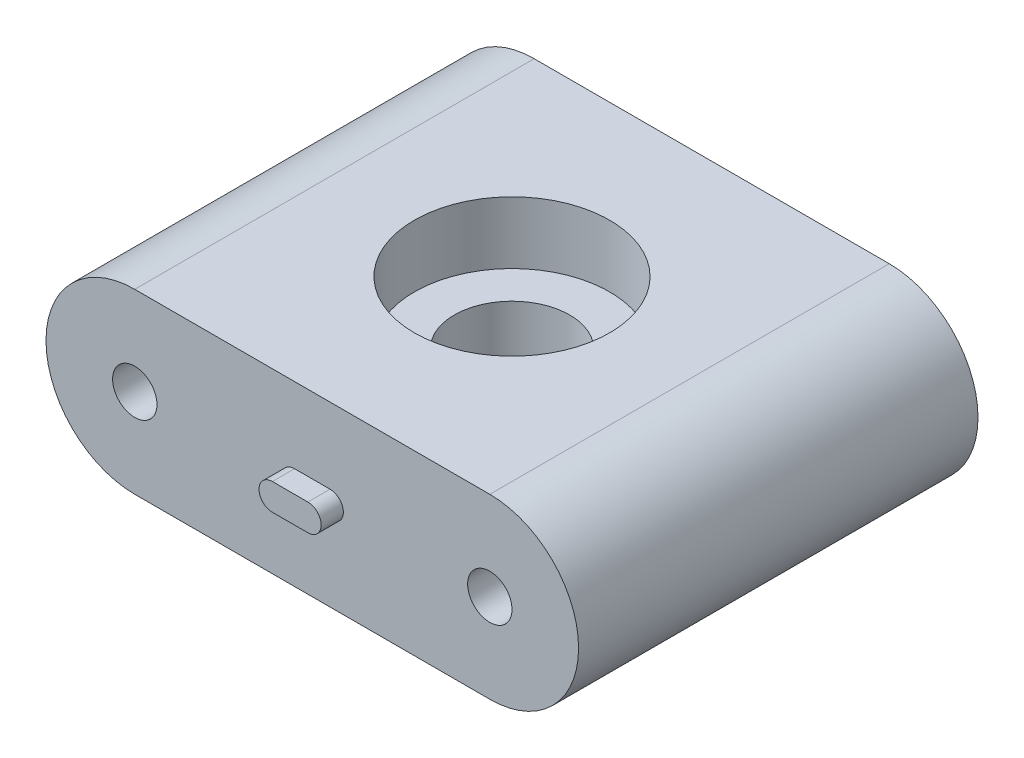
ISO-10303-21;
HEADER;
FILE_DESCRIPTION(('STEP AP214'),'2;1');
FILE_NAME('part.step','',(''),(''),'','','');
FILE_SCHEMA(('AUTOMOTIVE_DESIGN { 1 0 10303 214 1 1 1 1 }'));
ENDSEC;
DATA;
#1=APPLICATION_CONTEXT('core data for automotive mechanical design processes');
#2=APPLICATION_PROTOCOL_DEFINITION('international standard','automotive_design',2000,#1);
#3=PRODUCT_CONTEXT('',#1,'mechanical');
#4=PRODUCT('Part','Part','',(#3));
#5=PRODUCT_RELATED_PRODUCT_CATEGORY('part','',(#4));
#6=PRODUCT_DEFINITION_FORMATION('','',#4);
#7=PRODUCT_DEFINITION_CONTEXT('part definition',#1,'design');
#8=PRODUCT_DEFINITION('design','',#6,#7);
#9=PRODUCT_DEFINITION_SHAPE('','',#8);
#10=(LENGTH_UNIT() NAMED_UNIT(*) SI_UNIT(.MILLI.,.METRE.));
#11=(NAMED_UNIT(*) PLANE_ANGLE_UNIT() SI_UNIT($,.RADIAN.));
#12=(NAMED_UNIT(*) SI_UNIT($,.STERADIAN.) SOLID_ANGLE_UNIT());
#13=UNCERTAINTY_MEASURE_WITH_UNIT(LENGTH_MEASURE(1.E-05),#10,'distance_accuracy_value','');
#14=(GEOMETRIC_REPRESENTATION_CONTEXT(3) GLOBAL_UNCERTAINTY_ASSIGNED_CONTEXT((#13)) GLOBAL_UNIT_ASSIGNED_CONTEXT((#10,
#11,#12)) REPRESENTATION_CONTEXT('',''));
#15=CARTESIAN_POINT('',(0.,0.,0.));
#16=DIRECTION('',(0.,0.,1.));
#17=DIRECTION('',(1.,0.,0.));
#18=AXIS2_PLACEMENT_3D('',#15,#16,#17);
#19=CARTESIAN_POINT('',(-4.,0.,4.5));
#20=DIRECTION('',(0.,0.,1.));
#21=DIRECTION('',(1.,0.,0.));
#22=AXIS2_PLACEMENT_3D('',#19,#20,#21);
#23=PLANE('',#22);
#24=CARTESIAN_POINT('',(-4.,0.,4.5));
#25=DIRECTION('',(0.,0.,1.));
#26=DIRECTION('',(1.,0.,0.));
#27=AXIS2_PLACEMENT_3D('',#24,#25,#26);
#28=CIRCLE('',#27,0.5);
#29=CARTESIAN_POINT('',(-3.5,0.,4.5));
#30=VERTEX_POINT('',#29);
#31=EDGE_CURVE('E204',#30,#30,#28,.T.);
#32=ORIENTED_EDGE('',*,*,#31,.F.);
#33=EDGE_LOOP('',(#32));
#34=FACE_BOUND('',#33,.T.);
#35=CARTESIAN_POINT('',(-4.,0.,4.5));
#36=DIRECTION('',(0.,0.,1.));
#37=DIRECTION('',(1.,0.,0.));
#38=AXIS2_PLACEMENT_3D('',#35,#36,#37);
#39=CIRCLE('',#38,2.);
#40=CARTESIAN_POINT('',(-4.,2.,4.5));
#41=VERTEX_POINT('',#40);
#42=CARTESIAN_POINT('',(-4.,-2.,4.5));
#43=VERTEX_POINT('',#42);
#44=EDGE_CURVE('E212',#41,#43,#39,.T.);
#45=ORIENTED_EDGE('',*,*,#44,.T.);
#46=DIRECTION('',(1.,0.,0.));
#47=VECTOR('',#46,1.);
#48=CARTESIAN_POINT('',(-4.,-2.,4.5));
#49=LINE('',#48,#47);
#50=CARTESIAN_POINT('',(4.,-2.,4.5));
#51=VERTEX_POINT('',#50);
#52=EDGE_CURVE('E216',#43,#51,#49,.T.);
#53=ORIENTED_EDGE('',*,*,#52,.T.);
#54=CARTESIAN_POINT('',(4.,0.,4.5));
#55=DIRECTION('',(0.,0.,1.));
#56=DIRECTION('',(1.,0.,0.));
#57=AXIS2_PLACEMENT_3D('',#54,#55,#56);
#58=CIRCLE('',#57,2.);
#59=CARTESIAN_POINT('',(4.,2.,4.5));
#60=VERTEX_POINT('',#59);
#61=EDGE_CURVE('E220',#51,#60,#58,.T.);
#62=ORIENTED_EDGE('',*,*,#61,.T.);
#63=DIRECTION('',(-1.,0.,0.));
#64=VECTOR('',#63,1.);
#65=CARTESIAN_POINT('',(-4.,2.,4.5));
#66=LINE('',#65,#64);
#67=EDGE_CURVE('E223',#60,#41,#66,.T.);
#68=ORIENTED_EDGE('',*,*,#67,.T.);
#69=EDGE_LOOP('',(#45,#53,#62,#68));
#70=FACE_BOUND('',#69,.T.);
#71=CARTESIAN_POINT('',(4.,0.,4.5));
#72=DIRECTION('',(0.,0.,1.));
#73=DIRECTION('',(1.,0.,0.));
#74=AXIS2_PLACEMENT_3D('',#71,#72,#73);
#75=CIRCLE('',#74,0.500000000000001);
#76=CARTESIAN_POINT('',(4.5,0.,4.5));
#77=VERTEX_POINT('',#76);
#78=EDGE_CURVE('E196',#77,#77,#75,.T.);
#79=ORIENTED_EDGE('',*,*,#78,.F.);
#80=EDGE_LOOP('',(#79));
#81=FACE_BOUND('',#80,.T.);
#82=DIRECTION('',(1.,0.,0.));
#83=VECTOR('',#82,1.);
#84=CARTESIAN_POINT('',(-0.4,-0.3,4.5));
#85=LINE('',#84,#83);
#86=CARTESIAN_POINT('',(-0.4,-0.3,4.5));
#87=VERTEX_POINT('',#86);
#88=CARTESIAN_POINT('',(0.4,-0.3,4.5));
#89=VERTEX_POINT('',#88);
#90=EDGE_CURVE('E176',#87,#89,#85,.T.);
#91=ORIENTED_EDGE('',*,*,#90,.F.);
#92=CARTESIAN_POINT('',(-0.4,0.,4.5));
#93=DIRECTION('',(0.,0.,1.));
#94=DIRECTION('',(1.,0.,0.));
#95=AXIS2_PLACEMENT_3D('',#92,#93,#94);
#96=CIRCLE('',#95,0.3);
#97=CARTESIAN_POINT('',(-0.4,0.3,4.5));
#98=VERTEX_POINT('',#97);
#99=EDGE_CURVE('E161',#98,#87,#96,.T.);
#100=ORIENTED_EDGE('',*,*,#99,.F.);
#101=DIRECTION('',(-1.,0.,0.));
#102=VECTOR('',#101,1.);
#103=CARTESIAN_POINT('',(-0.4,0.3,4.5));
#104=LINE('',#103,#102);
#105=CARTESIAN_POINT('',(0.4,0.3,4.5));
#106=VERTEX_POINT('',#105);
#107=EDGE_CURVE('E61',#106,#98,#104,.T.);
#108=ORIENTED_EDGE('',*,*,#107,.F.);
#109=CARTESIAN_POINT('',(0.4,0.,4.5));
#110=DIRECTION('',(0.,0.,1.));
#111=DIRECTION('',(1.,0.,0.));
#112=AXIS2_PLACEMENT_3D('',#109,#110,#111);
#113=CIRCLE('',#112,0.3);
#114=EDGE_CURVE('E180',#89,#106,#113,.T.);
#115=ORIENTED_EDGE('',*,*,#114,.F.);
#116=EDGE_LOOP('',(#91,#100,#108,#115));
#117=FACE_BOUND('',#116,.T.);
#118=ADVANCED_FACE('F45',(#34,#70,#81,#117),#23,.T.);
#119=CARTESIAN_POINT('',(-4.,0.,-4.5));
#120=DIRECTION('',(0.,0.,1.));
#121=DIRECTION('',(1.,0.,0.));
#122=AXIS2_PLACEMENT_3D('',#119,#120,#121);
#123=PLANE('',#122);
#124=CARTESIAN_POINT('',(4.,0.,-4.5));
#125=DIRECTION('',(0.,0.,1.));
#126=DIRECTION('',(1.,0.,0.));
#127=AXIS2_PLACEMENT_3D('',#124,#125,#126);
#128=CIRCLE('',#127,0.500000000000001);
#129=CARTESIAN_POINT('',(4.5,0.,-4.5));
#130=VERTEX_POINT('',#129);
#131=EDGE_CURVE('E184',#130,#130,#128,.T.);
#132=ORIENTED_EDGE('',*,*,#131,.T.);
#133=EDGE_LOOP('',(#132));
#134=FACE_BOUND('',#133,.T.);
#135=CARTESIAN_POINT('',(-4.,0.,-4.5));
#136=DIRECTION('',(0.,0.,1.));
#137=DIRECTION('',(1.,0.,0.));
#138=AXIS2_PLACEMENT_3D('',#135,#136,#137);
#139=CIRCLE('',#138,0.5);
#140=CARTESIAN_POINT('',(-3.5,0.,-4.5));
#141=VERTEX_POINT('',#140);
#142=EDGE_CURVE('E200',#141,#141,#139,.T.);
#143=ORIENTED_EDGE('',*,*,#142,.T.);
#144=EDGE_LOOP('',(#143));
#145=FACE_BOUND('',#144,.T.);
#146=CARTESIAN_POINT('',(-4.,0.,-4.5));
#147=DIRECTION('',(0.,0.,1.));
#148=DIRECTION('',(1.,0.,0.));
#149=AXIS2_PLACEMENT_3D('',#146,#147,#148);
#150=CIRCLE('',#149,2.);
#151=CARTESIAN_POINT('',(-4.,2.,-4.5));
#152=VERTEX_POINT('',#151);
#153=CARTESIAN_POINT('',(-4.,-2.,-4.5));
#154=VERTEX_POINT('',#153);
#155=EDGE_CURVE('E208',#152,#154,#150,.T.);
#156=ORIENTED_EDGE('',*,*,#155,.F.);
#157=DIRECTION('',(-1.,0.,0.));
#158=VECTOR('',#157,1.);
#159=CARTESIAN_POINT('',(-4.,2.,-4.5));
#160=LINE('',#159,#158);
#161=CARTESIAN_POINT('',(4.,2.,-4.5));
#162=VERTEX_POINT('',#161);
#163=EDGE_CURVE('E217',#162,#152,#160,.T.);
#164=ORIENTED_EDGE('',*,*,#163,.F.);
#165=CARTESIAN_POINT('',(4.,0.,-4.5));
#166=DIRECTION('',(0.,0.,1.));
#167=DIRECTION('',(1.,0.,0.));
#168=AXIS2_PLACEMENT_3D('',#165,#166,#167);
#169=CIRCLE('',#168,2.);
#170=CARTESIAN_POINT('',(4.,-2.,-4.5));
#171=VERTEX_POINT('',#170);
#172=EDGE_CURVE('E233',#171,#162,#169,.T.);
#173=ORIENTED_EDGE('',*,*,#172,.F.);
#174=DIRECTION('',(1.,0.,0.));
#175=VECTOR('',#174,1.);
#176=CARTESIAN_POINT('',(-4.,-2.,-4.5));
#177=LINE('',#176,#175);
#178=EDGE_CURVE('E230',#154,#171,#177,.T.);
#179=ORIENTED_EDGE('',*,*,#178,.F.);
#180=EDGE_LOOP('',(#156,#164,#173,#179));
#181=FACE_BOUND('',#180,.T.);
#182=CARTESIAN_POINT('',(-0.4,0.,-4.5));
#183=DIRECTION('',(0.,0.,1.));
#184=DIRECTION('',(1.,0.,0.));
#185=AXIS2_PLACEMENT_3D('',#182,#183,#184);
#186=CIRCLE('',#185,0.3);
#187=CARTESIAN_POINT('',(-0.4,0.3,-4.5));
#188=VERTEX_POINT('',#187);
#189=CARTESIAN_POINT('',(-0.4,-0.3,-4.5));
#190=VERTEX_POINT('',#189);
#191=EDGE_CURVE('E163',#188,#190,#186,.T.);
#192=ORIENTED_EDGE('',*,*,#191,.T.);
#193=DIRECTION('',(1.,0.,0.));
#194=VECTOR('',#193,1.);
#195=CARTESIAN_POINT('',(-0.4,-0.3,-4.5));
#196=LINE('',#195,#194);
#197=CARTESIAN_POINT('',(0.4,-0.3,-4.5));
#198=VERTEX_POINT('',#197);
#199=EDGE_CURVE('E169',#190,#198,#196,.T.);
#200=ORIENTED_EDGE('',*,*,#199,.T.);
#201=CARTESIAN_POINT('',(0.4,0.,-4.5));
#202=DIRECTION('',(0.,0.,1.));
#203=DIRECTION('',(1.,0.,0.));
#204=AXIS2_PLACEMENT_3D('',#201,#202,#203);
#205=CIRCLE('',#204,0.3);
#206=CARTESIAN_POINT('',(0.4,0.3,-4.5));
#207=VERTEX_POINT('',#206);
#208=EDGE_CURVE('E189',#198,#207,#205,.T.);
#209=ORIENTED_EDGE('',*,*,#208,.T.);
#210=DIRECTION('',(-1.,0.,0.));
#211=VECTOR('',#210,1.);
#212=CARTESIAN_POINT('',(-0.4,0.3,-4.5));
#213=LINE('',#212,#211);
#214=EDGE_CURVE('E177',#207,#188,#213,.T.);
#215=ORIENTED_EDGE('',*,*,#214,.T.);
#216=EDGE_LOOP('',(#192,#200,#209,#215));
#217=FACE_BOUND('',#216,.T.);
#218=ADVANCED_FACE('F256',(#134,#145,#181,#217),#123,.F.);
#219=CARTESIAN_POINT('',(-4.,0.,4.5));
#220=DIRECTION('',(0.,0.,-1.));
#221=DIRECTION('',(-1.,0.,0.));
#222=AXIS2_PLACEMENT_3D('',#219,#220,#221);
#223=CYLINDRICAL_SURFACE('',#222,2.);
#224=ORIENTED_EDGE('',*,*,#155,.T.);
#225=DIRECTION('',(0.,0.,-1.));
#226=VECTOR('',#225,1.);
#227=CARTESIAN_POINT('',(-4.,-2.,4.5));
#228=LINE('',#227,#226);
#229=EDGE_CURVE('E11',#43,#154,#228,.T.);
#230=ORIENTED_EDGE('',*,*,#229,.F.);
#231=ORIENTED_EDGE('',*,*,#44,.F.);
#232=DIRECTION('',(0.,0.,-1.));
#233=VECTOR('',#232,1.);
#234=CARTESIAN_POINT('',(-4.,2.,4.5));
#235=LINE('',#234,#233);
#236=EDGE_CURVE('E226',#41,#152,#235,.T.);
#237=ORIENTED_EDGE('',*,*,#236,.T.);
#238=EDGE_LOOP('',(#224,#230,#231,#237));
#239=FACE_BOUND('',#238,.T.);
#240=ADVANCED_FACE('F47',(#239),#223,.T.);
#241=CARTESIAN_POINT('',(-4.,-2.,4.5));
#242=DIRECTION('',(0.,1.,0.));
#243=DIRECTION('',(0.,0.,1.));
#244=AXIS2_PLACEMENT_3D('',#241,#242,#243);
#245=PLANE('',#244);
#246=CARTESIAN_POINT('',(0.,-2.,0.));
#247=DIRECTION('',(0.,1.,0.));
#248=DIRECTION('',(0.,0.,1.));
#249=AXIS2_PLACEMENT_3D('',#246,#247,#248);
#250=CIRCLE('',#249,1.3);
#251=CARTESIAN_POINT('',(0.,-2.,1.3));
#252=VERTEX_POINT('',#251);
#253=EDGE_CURVE('E314',#252,#252,#250,.T.);
#254=ORIENTED_EDGE('',*,*,#253,.T.);
#255=EDGE_LOOP('',(#254));
#256=FACE_BOUND('',#255,.T.);
#257=ORIENTED_EDGE('',*,*,#178,.T.);
#258=DIRECTION('',(0.,0.,-1.));
#259=VECTOR('',#258,1.);
#260=CARTESIAN_POINT('',(4.,-2.,4.5));
#261=LINE('',#260,#259);
#262=EDGE_CURVE('E54',#51,#171,#261,.T.);
#263=ORIENTED_EDGE('',*,*,#262,.F.);
#264=ORIENTED_EDGE('',*,*,#52,.F.);
#265=ORIENTED_EDGE('',*,*,#229,.T.);
#266=EDGE_LOOP('',(#257,#263,#264,#265));
#267=FACE_BOUND('',#266,.T.);
#268=ADVANCED_FACE('F267',(#256,#267),#245,.F.);
#269=CARTESIAN_POINT('',(4.,0.,4.5));
#270=DIRECTION('',(0.,0.,-1.));
#271=DIRECTION('',(-1.,0.,0.));
#272=AXIS2_PLACEMENT_3D('',#269,#270,#271);
#273=CYLINDRICAL_SURFACE('',#272,2.);
#274=ORIENTED_EDGE('',*,*,#172,.T.);
#275=DIRECTION('',(0.,0.,-1.));
#276=VECTOR('',#275,1.);
#277=CARTESIAN_POINT('',(4.,2.,4.5));
#278=LINE('',#277,#276);
#279=EDGE_CURVE('E241',#60,#162,#278,.T.);
#280=ORIENTED_EDGE('',*,*,#279,.F.);
#281=ORIENTED_EDGE('',*,*,#61,.F.);
#282=ORIENTED_EDGE('',*,*,#262,.T.);
#283=EDGE_LOOP('',(#274,#280,#281,#282));
#284=FACE_BOUND('',#283,.T.);
#285=ADVANCED_FACE('F250',(#284),#273,.T.);
#286=CARTESIAN_POINT('',(-4.,2.,4.5));
#287=DIRECTION('',(0.,-1.,0.));
#288=DIRECTION('',(0.,0.,-1.));
#289=AXIS2_PLACEMENT_3D('',#286,#287,#288);
#290=PLANE('',#289);
#291=CARTESIAN_POINT('',(0.,2.,0.));
#292=DIRECTION('',(0.,1.,0.));
#293=DIRECTION('',(0.,0.,1.));
#294=AXIS2_PLACEMENT_3D('',#291,#292,#293);
#295=CIRCLE('',#294,2.2);
#296=CARTESIAN_POINT('',(0.,2.,2.2));
#297=VERTEX_POINT('',#296);
#298=EDGE_CURVE('E301',#297,#297,#295,.T.);
#299=ORIENTED_EDGE('',*,*,#298,.F.);
#300=EDGE_LOOP('',(#299));
#301=FACE_BOUND('',#300,.T.);
#302=ORIENTED_EDGE('',*,*,#163,.T.);
#303=ORIENTED_EDGE('',*,*,#236,.F.);
#304=ORIENTED_EDGE('',*,*,#67,.F.);
#305=ORIENTED_EDGE('',*,*,#279,.T.);
#306=EDGE_LOOP('',(#302,#303,#304,#305));
#307=FACE_BOUND('',#306,.T.);
#308=ADVANCED_FACE('F260',(#301,#307),#290,.F.);
#309=CARTESIAN_POINT('',(-4.,0.,4.5));
#310=DIRECTION('',(0.,0.,-1.));
#311=DIRECTION('',(-1.,0.,0.));
#312=AXIS2_PLACEMENT_3D('',#309,#310,#311);
#313=CYLINDRICAL_SURFACE('',#312,0.5);
#314=ORIENTED_EDGE('',*,*,#31,.T.);
#315=EDGE_LOOP('',(#314));
#316=FACE_BOUND('',#315,.T.);
#317=ORIENTED_EDGE('',*,*,#142,.F.);
#318=EDGE_LOOP('',(#317));
#319=FACE_BOUND('',#318,.T.);
#320=ADVANCED_FACE('F289',(#316,#319),#313,.F.);
#321=CARTESIAN_POINT('',(4.,0.,4.5));
#322=DIRECTION('',(0.,0.,-1.));
#323=DIRECTION('',(-1.,0.,0.));
#324=AXIS2_PLACEMENT_3D('',#321,#322,#323);
#325=CYLINDRICAL_SURFACE('',#324,0.500000000000001);
#326=ORIENTED_EDGE('',*,*,#78,.T.);
#327=EDGE_LOOP('',(#326));
#328=FACE_BOUND('',#327,.T.);
#329=ORIENTED_EDGE('',*,*,#131,.F.);
#330=EDGE_LOOP('',(#329));
#331=FACE_BOUND('',#330,.T.);
#332=ADVANCED_FACE('F297',(#328,#331),#325,.F.);
#333=CARTESIAN_POINT('',(-0.4,0.,-5.));
#334=DIRECTION('',(0.,0.,1.));
#335=DIRECTION('',(1.,0.,0.));
#336=AXIS2_PLACEMENT_3D('',#333,#334,#335);
#337=PLANE('',#336);
#338=CARTESIAN_POINT('',(-0.4,0.,-5.));
#339=DIRECTION('',(0.,0.,1.));
#340=DIRECTION('',(1.,0.,0.));
#341=AXIS2_PLACEMENT_3D('',#338,#339,#340);
#342=CIRCLE('',#341,0.3);
#343=CARTESIAN_POINT('',(-0.4,0.3,-5.));
#344=VERTEX_POINT('',#343);
#345=CARTESIAN_POINT('',(-0.4,-0.3,-5.));
#346=VERTEX_POINT('',#345);
#347=EDGE_CURVE('E316',#344,#346,#342,.T.);
#348=ORIENTED_EDGE('',*,*,#347,.F.);
#349=DIRECTION('',(1.,0.,0.));
#350=VECTOR('',#349,1.);
#351=CARTESIAN_POINT('',(-0.4,0.3,-5.));
#352=LINE('',#351,#350);
#353=CARTESIAN_POINT('',(0.4,0.3,-5.));
#354=VERTEX_POINT('',#353);
#355=EDGE_CURVE('E157',#344,#354,#352,.T.);
#356=ORIENTED_EDGE('',*,*,#355,.T.);
#357=CARTESIAN_POINT('',(0.4,0.,-5.));
#358=DIRECTION('',(0.,0.,1.));
#359=DIRECTION('',(1.,0.,0.));
#360=AXIS2_PLACEMENT_3D('',#357,#358,#359);
#361=CIRCLE('',#360,0.3);
#362=CARTESIAN_POINT('',(0.4,-0.3,-5.));
#363=VERTEX_POINT('',#362);
#364=EDGE_CURVE('E329',#363,#354,#361,.T.);
#365=ORIENTED_EDGE('',*,*,#364,.F.);
#366=DIRECTION('',(1.,0.,0.));
#367=VECTOR('',#366,1.);
#368=CARTESIAN_POINT('',(-0.4,-0.3,-5.));
#369=LINE('',#368,#367);
#370=EDGE_CURVE('E325',#346,#363,#369,.T.);
#371=ORIENTED_EDGE('',*,*,#370,.F.);
#372=EDGE_LOOP('',(#348,#356,#365,#371));
#373=FACE_BOUND('',#372,.T.);
#374=ADVANCED_FACE('F356',(#373),#337,.F.);
#375=CARTESIAN_POINT('',(-0.4,0.3,5.));
#376=DIRECTION('',(0.,1.,0.));
#377=DIRECTION('',(-1.,0.,0.));
#378=AXIS2_PLACEMENT_3D('',#375,#376,#377);
#379=PLANE('',#378);
#380=ORIENTED_EDGE('',*,*,#214,.F.);
#381=DIRECTION('',(0.,0.,-1.));
#382=VECTOR('',#381,1.);
#383=CARTESIAN_POINT('',(0.4,0.3,5.));
#384=LINE('',#383,#382);
#385=EDGE_CURVE('E338',#207,#354,#384,.T.);
#386=ORIENTED_EDGE('',*,*,#385,.T.);
#387=ORIENTED_EDGE('',*,*,#355,.F.);
#388=DIRECTION('',(0.,0.,-1.));
#389=VECTOR('',#388,1.);
#390=CARTESIAN_POINT('',(-0.4,0.3,5.));
#391=LINE('',#390,#389);
#392=EDGE_CURVE('E69',#188,#344,#391,.T.);
#393=ORIENTED_EDGE('',*,*,#392,.F.);
#394=EDGE_LOOP('',(#380,#386,#387,#393));
#395=FACE_BOUND('',#394,.T.);
#396=ADVANCED_FACE('F348',(#395),#379,.T.);
#397=CARTESIAN_POINT('',(0.4,0.,5.));
#398=DIRECTION('',(0.,0.,-1.));
#399=DIRECTION('',(-1.,0.,0.));
#400=AXIS2_PLACEMENT_3D('',#397,#398,#399);
#401=CYLINDRICAL_SURFACE('',#400,0.3);
#402=ORIENTED_EDGE('',*,*,#385,.F.);
#403=ORIENTED_EDGE('',*,*,#208,.F.);
#404=DIRECTION('',(0.,0.,-1.));
#405=VECTOR('',#404,1.);
#406=CARTESIAN_POINT('',(0.4,-0.3,5.));
#407=LINE('',#406,#405);
#408=EDGE_CURVE('E342',#198,#363,#407,.T.);
#409=ORIENTED_EDGE('',*,*,#408,.T.);
#410=ORIENTED_EDGE('',*,*,#364,.T.);
#411=EDGE_LOOP('',(#402,#403,#409,#410));
#412=FACE_BOUND('',#411,.T.);
#413=ADVANCED_FACE('F351',(#412),#401,.T.);
#414=CARTESIAN_POINT('',(-0.4,-0.3,5.));
#415=DIRECTION('',(0.,1.,0.));
#416=DIRECTION('',(0.,0.,1.));
#417=AXIS2_PLACEMENT_3D('',#414,#415,#416);
#418=PLANE('',#417);
#419=ORIENTED_EDGE('',*,*,#408,.F.);
#420=ORIENTED_EDGE('',*,*,#199,.F.);
#421=DIRECTION('',(0.,0.,-1.));
#422=VECTOR('',#421,1.);
#423=CARTESIAN_POINT('',(-0.4,-0.3,5.));
#424=LINE('',#423,#422);
#425=EDGE_CURVE('E164',#190,#346,#424,.T.);
#426=ORIENTED_EDGE('',*,*,#425,.T.);
#427=ORIENTED_EDGE('',*,*,#370,.T.);
#428=EDGE_LOOP('',(#419,#420,#426,#427));
#429=FACE_BOUND('',#428,.T.);
#430=ADVANCED_FACE('F362',(#429),#418,.F.);
#431=CARTESIAN_POINT('',(-0.4,0.,5.));
#432=DIRECTION('',(0.,0.,-1.));
#433=DIRECTION('',(-1.,0.,0.));
#434=AXIS2_PLACEMENT_3D('',#431,#432,#433);
#435=CYLINDRICAL_SURFACE('',#434,0.3);
#436=ORIENTED_EDGE('',*,*,#425,.F.);
#437=ORIENTED_EDGE('',*,*,#191,.F.);
#438=ORIENTED_EDGE('',*,*,#392,.T.);
#439=ORIENTED_EDGE('',*,*,#347,.T.);
#440=EDGE_LOOP('',(#436,#437,#438,#439));
#441=FACE_BOUND('',#440,.T.);
#442=ADVANCED_FACE('F359',(#441),#435,.T.);
#443=ORIENTED_EDGE('',*,*,#99,.T.);
#444=CARTESIAN_POINT('',(-0.4,-0.3,5.));
#445=VERTEX_POINT('',#444);
#446=EDGE_CURVE('E140',#445,#87,#424,.T.);
#447=ORIENTED_EDGE('',*,*,#446,.F.);
#448=CARTESIAN_POINT('',(-0.4,0.,5.));
#449=DIRECTION('',(0.,0.,1.));
#450=DIRECTION('',(1.,0.,0.));
#451=AXIS2_PLACEMENT_3D('',#448,#449,#450);
#452=CIRCLE('',#451,0.3);
#453=CARTESIAN_POINT('',(-0.4,0.3,5.));
#454=VERTEX_POINT('',#453);
#455=EDGE_CURVE('E147',#454,#445,#452,.T.);
#456=ORIENTED_EDGE('',*,*,#455,.F.);
#457=EDGE_CURVE('E336',#454,#98,#391,.T.);
#458=ORIENTED_EDGE('',*,*,#457,.T.);
#459=EDGE_LOOP('',(#443,#447,#456,#458));
#460=FACE_BOUND('',#459,.T.);
#461=ADVANCED_FACE('F160',(#460),#435,.T.);
#462=ORIENTED_EDGE('',*,*,#90,.T.);
#463=CARTESIAN_POINT('',(0.4,-0.3,5.));
#464=VERTEX_POINT('',#463);
#465=EDGE_CURVE('E142',#464,#89,#407,.T.);
#466=ORIENTED_EDGE('',*,*,#465,.F.);
#467=DIRECTION('',(1.,0.,0.));
#468=VECTOR('',#467,1.);
#469=CARTESIAN_POINT('',(-0.4,-0.3,5.));
#470=LINE('',#469,#468);
#471=EDGE_CURVE('E135',#445,#464,#470,.T.);
#472=ORIENTED_EDGE('',*,*,#471,.F.);
#473=ORIENTED_EDGE('',*,*,#446,.T.);
#474=EDGE_LOOP('',(#462,#466,#472,#473));
#475=FACE_BOUND('',#474,.T.);
#476=ADVANCED_FACE('F138',(#475),#418,.F.);
#477=ORIENTED_EDGE('',*,*,#114,.T.);
#478=CARTESIAN_POINT('',(0.4,0.3,5.));
#479=VERTEX_POINT('',#478);
#480=EDGE_CURVE('E339',#479,#106,#384,.T.);
#481=ORIENTED_EDGE('',*,*,#480,.F.);
#482=CARTESIAN_POINT('',(0.4,0.,5.));
#483=DIRECTION('',(0.,0.,1.));
#484=DIRECTION('',(1.,0.,0.));
#485=AXIS2_PLACEMENT_3D('',#482,#483,#484);
#486=CIRCLE('',#485,0.3);
#487=EDGE_CURVE('E146',#464,#479,#486,.T.);
#488=ORIENTED_EDGE('',*,*,#487,.F.);
#489=ORIENTED_EDGE('',*,*,#465,.T.);
#490=EDGE_LOOP('',(#477,#481,#488,#489));
#491=FACE_BOUND('',#490,.T.);
#492=ADVANCED_FACE('F371',(#491),#401,.T.);
#493=ORIENTED_EDGE('',*,*,#480,.T.);
#494=ORIENTED_EDGE('',*,*,#107,.T.);
#495=ORIENTED_EDGE('',*,*,#457,.F.);
#496=DIRECTION('',(1.,0.,0.));
#497=VECTOR('',#496,1.);
#498=CARTESIAN_POINT('',(-0.4,0.3,5.));
#499=LINE('',#498,#497);
#500=EDGE_CURVE('E153',#454,#479,#499,.T.);
#501=ORIENTED_EDGE('',*,*,#500,.T.);
#502=EDGE_LOOP('',(#493,#494,#495,#501));
#503=FACE_BOUND('',#502,.T.);
#504=ADVANCED_FACE('F377',(#503),#379,.T.);
#505=CARTESIAN_POINT('',(-0.4,0.,5.));
#506=DIRECTION('',(0.,0.,1.));
#507=DIRECTION('',(1.,0.,0.));
#508=AXIS2_PLACEMENT_3D('',#505,#506,#507);
#509=PLANE('',#508);
#510=ORIENTED_EDGE('',*,*,#455,.T.);
#511=ORIENTED_EDGE('',*,*,#471,.T.);
#512=ORIENTED_EDGE('',*,*,#487,.T.);
#513=ORIENTED_EDGE('',*,*,#500,.F.);
#514=EDGE_LOOP('',(#510,#511,#512,#513));
#515=FACE_BOUND('',#514,.T.);
#516=ADVANCED_FACE('F151',(#515),#509,.T.);
#517=CARTESIAN_POINT('',(0.,2.,0.));
#518=DIRECTION('',(0.,1.,0.));
#519=DIRECTION('',(0.,0.,1.));
#520=AXIS2_PLACEMENT_3D('',#517,#518,#519);
#521=CYLINDRICAL_SURFACE('',#520,1.3);
#522=ORIENTED_EDGE('',*,*,#253,.F.);
#523=EDGE_LOOP('',(#522));
#524=FACE_BOUND('',#523,.T.);
#525=CARTESIAN_POINT('',(0.,0.6,0.));
#526=DIRECTION('',(0.,1.,0.));
#527=DIRECTION('',(0.,0.,1.));
#528=AXIS2_PLACEMENT_3D('',#525,#526,#527);
#529=CIRCLE('',#528,1.3);
#530=CARTESIAN_POINT('',(0.,0.6,1.3));
#531=VERTEX_POINT('',#530);
#532=EDGE_CURVE('E308',#531,#531,#529,.T.);
#533=ORIENTED_EDGE('',*,*,#532,.T.);
#534=EDGE_LOOP('',(#533));
#535=FACE_BOUND('',#534,.T.);
#536=ADVANCED_FACE('F397',(#524,#535),#521,.F.);
#537=CARTESIAN_POINT('',(1.3,0.6,0.));
#538=DIRECTION('',(0.,-1.,0.));
#539=DIRECTION('',(0.,0.,-1.));
#540=AXIS2_PLACEMENT_3D('',#537,#538,#539);
#541=PLANE('',#540);
#542=ORIENTED_EDGE('',*,*,#532,.F.);
#543=EDGE_LOOP('',(#542));
#544=FACE_BOUND('',#543,.T.);
#545=CARTESIAN_POINT('',(0.,0.6,0.));
#546=DIRECTION('',(0.,1.,0.));
#547=DIRECTION('',(0.,0.,1.));
#548=AXIS2_PLACEMENT_3D('',#545,#546,#547);
#549=CIRCLE('',#548,2.2);
#550=CARTESIAN_POINT('',(0.,0.6,2.2));
#551=VERTEX_POINT('',#550);
#552=EDGE_CURVE('E304',#551,#551,#549,.T.);
#553=ORIENTED_EDGE('',*,*,#552,.T.);
#554=EDGE_LOOP('',(#553));
#555=FACE_BOUND('',#554,.T.);
#556=ADVANCED_FACE('F452',(#544,#555),#541,.F.);
#557=CARTESIAN_POINT('',(0.,2.,0.));
#558=DIRECTION('',(0.,1.,0.));
#559=DIRECTION('',(0.,0.,1.));
#560=AXIS2_PLACEMENT_3D('',#557,#558,#559);
#561=CYLINDRICAL_SURFACE('',#560,2.2);
#562=ORIENTED_EDGE('',*,*,#552,.F.);
#563=EDGE_LOOP('',(#562));
#564=FACE_BOUND('',#563,.T.);
#565=ORIENTED_EDGE('',*,*,#298,.T.);
#566=EDGE_LOOP('',(#565));
#567=FACE_BOUND('',#566,.T.);
#568=ADVANCED_FACE('F462',(#564,#567),#561,.F.);
#569=CLOSED_SHELL('',(#118,#218,#240,#268,#285,#308,#320,#332,#374,#396,#413,#430,#442,#461,
#476,#492,#504,#516,#536,#556,#568));
#570=MANIFOLD_SOLID_BREP('B2',#569);
#571=ADVANCED_BREP_SHAPE_REPRESENTATION('',(#18,#570),#14);
#572=SHAPE_DEFINITION_REPRESENTATION(#9,#571);
ENDSEC;
END-ISO-10303-21;
